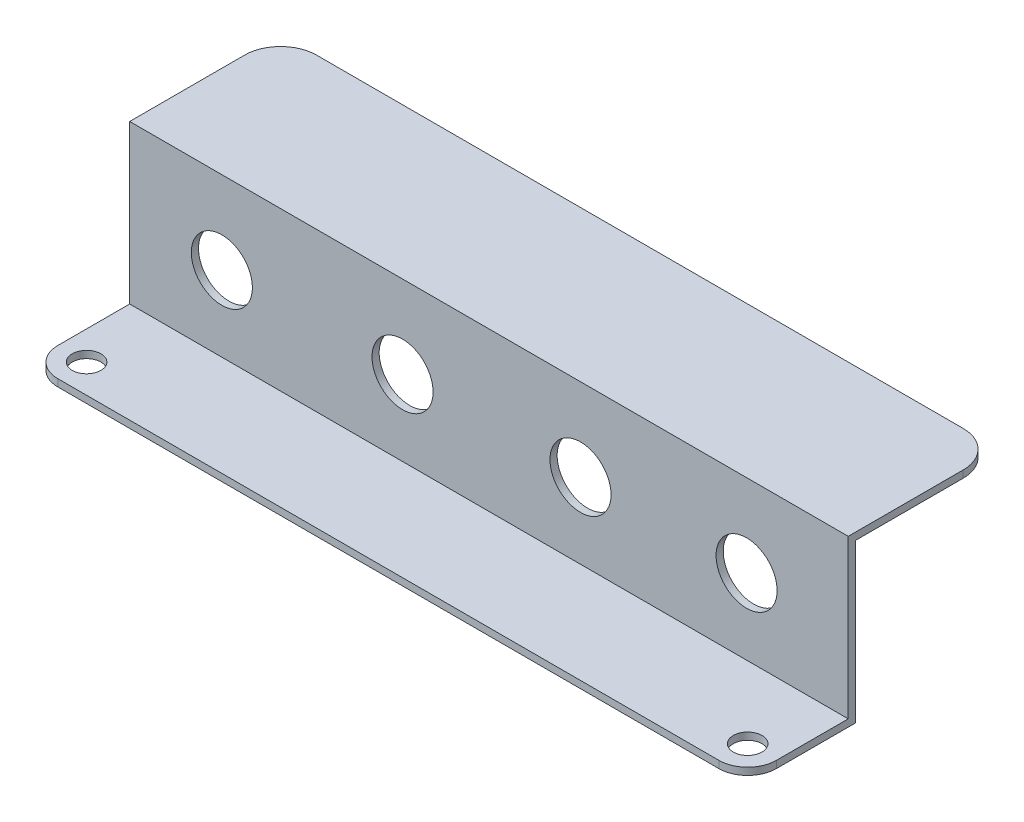
ISO-10303-21;
HEADER;
FILE_DESCRIPTION(('STEP AP214'),'2;1');
FILE_NAME('part.step','',(''),(''),'','','');
FILE_SCHEMA(('AUTOMOTIVE_DESIGN { 1 0 10303 214 1 1 1 1 }'));
ENDSEC;
DATA;
#1=APPLICATION_CONTEXT('core data for automotive mechanical design processes');
#2=APPLICATION_PROTOCOL_DEFINITION('international standard','automotive_design',2000,#1);
#3=PRODUCT_CONTEXT('',#1,'mechanical');
#4=PRODUCT('Part','Part','',(#3));
#5=PRODUCT_RELATED_PRODUCT_CATEGORY('part','',(#4));
#6=PRODUCT_DEFINITION_FORMATION('','',#4);
#7=PRODUCT_DEFINITION_CONTEXT('part definition',#1,'design');
#8=PRODUCT_DEFINITION('design','',#6,#7);
#9=PRODUCT_DEFINITION_SHAPE('','',#8);
#10=(LENGTH_UNIT() NAMED_UNIT(*) SI_UNIT(.MILLI.,.METRE.));
#11=(NAMED_UNIT(*) PLANE_ANGLE_UNIT() SI_UNIT($,.RADIAN.));
#12=(NAMED_UNIT(*) SI_UNIT($,.STERADIAN.) SOLID_ANGLE_UNIT());
#13=UNCERTAINTY_MEASURE_WITH_UNIT(LENGTH_MEASURE(1.E-05),#10,'distance_accuracy_value','');
#14=(GEOMETRIC_REPRESENTATION_CONTEXT(3) GLOBAL_UNCERTAINTY_ASSIGNED_CONTEXT((#13)) GLOBAL_UNIT_ASSIGNED_CONTEXT((#10,
#11,#12)) REPRESENTATION_CONTEXT('',''));
#15=CARTESIAN_POINT('',(0.,0.,0.));
#16=DIRECTION('',(0.,0.,1.));
#17=DIRECTION('',(1.,0.,0.));
#18=AXIS2_PLACEMENT_3D('',#15,#16,#17);
#19=CARTESIAN_POINT('',(0.,0.,11.));
#20=DIRECTION('',(0.,0.,1.));
#21=DIRECTION('',(1.,0.,0.));
#22=AXIS2_PLACEMENT_3D('',#19,#20,#21);
#23=PLANE('',#22);
#24=CARTESIAN_POINT('',(-37.1729743459487,-10.5,11.));
#25=DIRECTION('',(0.,0.,1.));
#26=DIRECTION('',(1.,0.,0.));
#27=AXIS2_PLACEMENT_3D('',#24,#25,#26);
#28=CIRCLE('',#27,4.25000000000001);
#29=CARTESIAN_POINT('',(-32.9229743459487,-10.5,11.));
#30=VERTEX_POINT('',#29);
#31=EDGE_CURVE('E313',#30,#30,#28,.T.);
#32=ORIENTED_EDGE('',*,*,#31,.F.);
#33=EDGE_LOOP('',(#32));
#34=FACE_BOUND('',#33,.T.);
#35=CARTESIAN_POINT('',(35.8521717043434,-10.5,11.));
#36=DIRECTION('',(0.,0.,1.));
#37=DIRECTION('',(1.,0.,0.));
#38=AXIS2_PLACEMENT_3D('',#35,#36,#37);
#39=CIRCLE('',#38,4.25000000000001);
#40=CARTESIAN_POINT('',(40.1021717043434,-10.5,11.));
#41=VERTEX_POINT('',#40);
#42=EDGE_CURVE('E312',#41,#41,#39,.T.);
#43=ORIENTED_EDGE('',*,*,#42,.F.);
#44=EDGE_LOOP('',(#43));
#45=FACE_BOUND('',#44,.T.);
#46=CARTESIAN_POINT('',(12.7381254762509,-10.5,11.));
#47=DIRECTION('',(0.,0.,1.));
#48=DIRECTION('',(1.,0.,0.));
#49=AXIS2_PLACEMENT_3D('',#46,#47,#48);
#50=CIRCLE('',#49,4.25);
#51=CARTESIAN_POINT('',(16.9881254762509,-10.5,11.));
#52=VERTEX_POINT('',#51);
#53=EDGE_CURVE('E319',#52,#52,#50,.T.);
#54=ORIENTED_EDGE('',*,*,#53,.F.);
#55=EDGE_LOOP('',(#54));
#56=FACE_BOUND('',#55,.T.);
#57=CARTESIAN_POINT('',(-12.026924053848,-10.5,11.));
#58=DIRECTION('',(0.,0.,1.));
#59=DIRECTION('',(1.,0.,0.));
#60=AXIS2_PLACEMENT_3D('',#57,#58,#59);
#61=CIRCLE('',#60,4.25);
#62=CARTESIAN_POINT('',(-7.77692405384802,-10.5,11.));
#63=VERTEX_POINT('',#62);
#64=EDGE_CURVE('E305',#63,#63,#61,.T.);
#65=ORIENTED_EDGE('',*,*,#64,.F.);
#66=EDGE_LOOP('',(#65));
#67=FACE_BOUND('',#66,.T.);
#68=DIRECTION('',(0.,-1.,0.));
#69=VECTOR('',#68,1.);
#70=CARTESIAN_POINT('',(-50.,1.,11.));
#71=LINE('',#70,#69);
#72=CARTESIAN_POINT('',(-50.,1.,11.));
#73=VERTEX_POINT('',#72);
#74=CARTESIAN_POINT('',(-50.,-21.,11.));
#75=VERTEX_POINT('',#74);
#76=EDGE_CURVE('E129',#73,#75,#71,.T.);
#77=ORIENTED_EDGE('',*,*,#76,.T.);
#78=DIRECTION('',(1.,0.,0.));
#79=VECTOR('',#78,1.);
#80=CARTESIAN_POINT('',(-50.,-21.,11.));
#81=LINE('',#80,#79);
#82=CARTESIAN_POINT('',(50.,-21.,11.));
#83=VERTEX_POINT('',#82);
#84=EDGE_CURVE('E135',#75,#83,#81,.T.);
#85=ORIENTED_EDGE('',*,*,#84,.T.);
#86=DIRECTION('',(0.,1.,0.));
#87=VECTOR('',#86,1.);
#88=CARTESIAN_POINT('',(50.,1.,11.));
#89=LINE('',#88,#87);
#90=CARTESIAN_POINT('',(50.,1.,11.));
#91=VERTEX_POINT('',#90);
#92=EDGE_CURVE('E148',#83,#91,#89,.T.);
#93=ORIENTED_EDGE('',*,*,#92,.T.);
#94=DIRECTION('',(-1.,0.,0.));
#95=VECTOR('',#94,1.);
#96=CARTESIAN_POINT('',(-50.,1.,11.));
#97=LINE('',#96,#95);
#98=EDGE_CURVE('E147',#91,#73,#97,.T.);
#99=ORIENTED_EDGE('',*,*,#98,.T.);
#100=EDGE_LOOP('',(#77,#85,#93,#99));
#101=FACE_BOUND('',#100,.T.);
#102=ADVANCED_FACE('F33',(#34,#45,#56,#67,#101),#23,.T.);
#103=CARTESIAN_POINT('',(50.,1.,10.));
#104=DIRECTION('',(-1.,0.,0.));
#105=DIRECTION('',(0.,0.,1.));
#106=AXIS2_PLACEMENT_3D('',#103,#104,#105);
#107=PLANE('',#106);
#108=DIRECTION('',(0.,0.,-1.));
#109=VECTOR('',#108,1.);
#110=CARTESIAN_POINT('',(50.,0.,10.));
#111=LINE('',#110,#109);
#112=CARTESIAN_POINT('',(50.,0.,10.));
#113=VERTEX_POINT('',#112);
#114=CARTESIAN_POINT('',(50.,0.,-5.));
#115=VERTEX_POINT('',#114);
#116=EDGE_CURVE('E169',#113,#115,#111,.T.);
#117=ORIENTED_EDGE('',*,*,#116,.T.);
#118=DIRECTION('',(0.,-1.,0.));
#119=VECTOR('',#118,1.);
#120=CARTESIAN_POINT('',(50.,1.,-5.));
#121=LINE('',#120,#119);
#122=CARTESIAN_POINT('',(50.,1.,-5.));
#123=VERTEX_POINT('',#122);
#124=EDGE_CURVE('E56',#115,#123,#121,.F.);
#125=ORIENTED_EDGE('',*,*,#124,.T.);
#126=DIRECTION('',(0.,0.,-1.));
#127=VECTOR('',#126,1.);
#128=CARTESIAN_POINT('',(50.,1.,10.));
#129=LINE('',#128,#127);
#130=EDGE_CURVE('E170',#91,#123,#129,.T.);
#131=ORIENTED_EDGE('',*,*,#130,.F.);
#132=ORIENTED_EDGE('',*,*,#92,.F.);
#133=DIRECTION('',(0.,0.,1.));
#134=VECTOR('',#133,1.);
#135=CARTESIAN_POINT('',(50.,-21.,11.));
#136=LINE('',#135,#134);
#137=CARTESIAN_POINT('',(50.,-21.,21.));
#138=VERTEX_POINT('',#137);
#139=EDGE_CURVE('E141',#83,#138,#136,.T.);
#140=ORIENTED_EDGE('',*,*,#139,.T.);
#141=DIRECTION('',(0.,-1.,0.));
#142=VECTOR('',#141,1.);
#143=CARTESIAN_POINT('',(50.,-22.,21.));
#144=LINE('',#143,#142);
#145=CARTESIAN_POINT('',(50.,-22.,21.));
#146=VERTEX_POINT('',#145);
#147=EDGE_CURVE('E199',#138,#146,#144,.T.);
#148=ORIENTED_EDGE('',*,*,#147,.T.);
#149=DIRECTION('',(0.,0.,-1.));
#150=VECTOR('',#149,1.);
#151=CARTESIAN_POINT('',(50.,-22.,11.));
#152=LINE('',#151,#150);
#153=CARTESIAN_POINT('',(50.,-22.,10.));
#154=VERTEX_POINT('',#153);
#155=EDGE_CURVE('E159',#146,#154,#152,.T.);
#156=ORIENTED_EDGE('',*,*,#155,.T.);
#157=DIRECTION('',(0.,1.,0.));
#158=VECTOR('',#157,1.);
#159=CARTESIAN_POINT('',(50.,1.,10.));
#160=LINE('',#159,#158);
#161=EDGE_CURVE('E149',#154,#113,#160,.T.);
#162=ORIENTED_EDGE('',*,*,#161,.T.);
#163=EDGE_LOOP('',(#117,#125,#131,#132,#140,#148,#156,#162));
#164=FACE_BOUND('',#163,.T.);
#165=ADVANCED_FACE('F225',(#164),#107,.F.);
#166=CARTESIAN_POINT('',(-50.,1.,-10.));
#167=DIRECTION('',(0.,0.,1.));
#168=DIRECTION('',(1.,0.,0.));
#169=AXIS2_PLACEMENT_3D('',#166,#167,#168);
#170=PLANE('',#169);
#171=DIRECTION('',(-1.,0.,0.));
#172=VECTOR('',#171,1.);
#173=CARTESIAN_POINT('',(-50.,1.,-10.));
#174=LINE('',#173,#172);
#175=CARTESIAN_POINT('',(45.,1.,-10.));
#176=VERTEX_POINT('',#175);
#177=CARTESIAN_POINT('',(-45.,1.,-10.));
#178=VERTEX_POINT('',#177);
#179=EDGE_CURVE('E172',#176,#178,#174,.T.);
#180=ORIENTED_EDGE('',*,*,#179,.F.);
#181=DIRECTION('',(0.,-1.,0.));
#182=VECTOR('',#181,1.);
#183=CARTESIAN_POINT('',(45.,1.,-10.));
#184=LINE('',#183,#182);
#185=CARTESIAN_POINT('',(45.,0.,-10.));
#186=VERTEX_POINT('',#185);
#187=EDGE_CURVE('E204',#176,#186,#184,.T.);
#188=ORIENTED_EDGE('',*,*,#187,.T.);
#189=DIRECTION('',(-1.,0.,0.));
#190=VECTOR('',#189,1.);
#191=CARTESIAN_POINT('',(-50.,0.,-10.));
#192=LINE('',#191,#190);
#193=CARTESIAN_POINT('',(-45.,0.,-10.));
#194=VERTEX_POINT('',#193);
#195=EDGE_CURVE('E179',#186,#194,#192,.T.);
#196=ORIENTED_EDGE('',*,*,#195,.T.);
#197=DIRECTION('',(0.,-1.,0.));
#198=VECTOR('',#197,1.);
#199=CARTESIAN_POINT('',(-45.,1.,-10.));
#200=LINE('',#199,#198);
#201=EDGE_CURVE('E202',#194,#178,#200,.F.);
#202=ORIENTED_EDGE('',*,*,#201,.T.);
#203=EDGE_LOOP('',(#180,#188,#196,#202));
#204=FACE_BOUND('',#203,.T.);
#205=ADVANCED_FACE('F218',(#204),#170,.F.);
#206=CARTESIAN_POINT('',(-50.,1.,10.));
#207=DIRECTION('',(1.,0.,0.));
#208=DIRECTION('',(0.,0.,-1.));
#209=AXIS2_PLACEMENT_3D('',#206,#207,#208);
#210=PLANE('',#209);
#211=DIRECTION('',(0.,0.,1.));
#212=VECTOR('',#211,1.);
#213=CARTESIAN_POINT('',(-50.,1.,10.));
#214=LINE('',#213,#212);
#215=CARTESIAN_POINT('',(-50.,1.,-5.));
#216=VERTEX_POINT('',#215);
#217=EDGE_CURVE('E175',#216,#73,#214,.T.);
#218=ORIENTED_EDGE('',*,*,#217,.F.);
#219=DIRECTION('',(0.,-1.,0.));
#220=VECTOR('',#219,1.);
#221=CARTESIAN_POINT('',(-50.,1.,-5.));
#222=LINE('',#221,#220);
#223=CARTESIAN_POINT('',(-50.,0.,-5.));
#224=VERTEX_POINT('',#223);
#225=EDGE_CURVE('E11',#216,#224,#222,.T.);
#226=ORIENTED_EDGE('',*,*,#225,.T.);
#227=DIRECTION('',(0.,0.,1.));
#228=VECTOR('',#227,1.);
#229=CARTESIAN_POINT('',(-50.,0.,10.));
#230=LINE('',#229,#228);
#231=CARTESIAN_POINT('',(-50.,0.,10.));
#232=VERTEX_POINT('',#231);
#233=EDGE_CURVE('E182',#224,#232,#230,.T.);
#234=ORIENTED_EDGE('',*,*,#233,.T.);
#235=DIRECTION('',(0.,-1.,0.));
#236=VECTOR('',#235,1.);
#237=CARTESIAN_POINT('',(-50.,1.,10.));
#238=LINE('',#237,#236);
#239=CARTESIAN_POINT('',(-50.,-22.,10.));
#240=VERTEX_POINT('',#239);
#241=EDGE_CURVE('E160',#232,#240,#238,.T.);
#242=ORIENTED_EDGE('',*,*,#241,.T.);
#243=DIRECTION('',(0.,0.,-1.));
#244=VECTOR('',#243,1.);
#245=CARTESIAN_POINT('',(-50.,-22.,11.));
#246=LINE('',#245,#244);
#247=CARTESIAN_POINT('',(-50.,-22.,21.));
#248=VERTEX_POINT('',#247);
#249=EDGE_CURVE('E167',#248,#240,#246,.T.);
#250=ORIENTED_EDGE('',*,*,#249,.F.);
#251=DIRECTION('',(0.,-1.,0.));
#252=VECTOR('',#251,1.);
#253=CARTESIAN_POINT('',(-50.,-21.,21.));
#254=LINE('',#253,#252);
#255=CARTESIAN_POINT('',(-50.,-21.,21.));
#256=VERTEX_POINT('',#255);
#257=EDGE_CURVE('E132',#248,#256,#254,.F.);
#258=ORIENTED_EDGE('',*,*,#257,.T.);
#259=DIRECTION('',(0.,0.,-1.));
#260=VECTOR('',#259,1.);
#261=CARTESIAN_POINT('',(-50.,-21.,11.));
#262=LINE('',#261,#260);
#263=EDGE_CURVE('E125',#256,#75,#262,.T.);
#264=ORIENTED_EDGE('',*,*,#263,.T.);
#265=ORIENTED_EDGE('',*,*,#76,.F.);
#266=EDGE_LOOP('',(#218,#226,#234,#242,#250,#258,#264,#265));
#267=FACE_BOUND('',#266,.T.);
#268=ADVANCED_FACE('F127',(#267),#210,.F.);
#269=CARTESIAN_POINT('',(0.,1.,0.));
#270=DIRECTION('',(0.,-1.,0.));
#271=DIRECTION('',(0.,0.,-1.));
#272=AXIS2_PLACEMENT_3D('',#269,#270,#271);
#273=PLANE('',#272);
#274=ORIENTED_EDGE('',*,*,#130,.T.);
#275=CARTESIAN_POINT('',(45.,1.,-5.));
#276=DIRECTION('',(0.,-1.,0.));
#277=DIRECTION('',(0.,0.,-1.));
#278=AXIS2_PLACEMENT_3D('',#275,#276,#277);
#279=CIRCLE('',#278,5.);
#280=EDGE_CURVE('E41',#123,#176,#279,.F.);
#281=ORIENTED_EDGE('',*,*,#280,.T.);
#282=ORIENTED_EDGE('',*,*,#179,.T.);
#283=CARTESIAN_POINT('',(-45.,1.,-5.));
#284=DIRECTION('',(0.,-1.,0.));
#285=DIRECTION('',(0.,0.,-1.));
#286=AXIS2_PLACEMENT_3D('',#283,#284,#285);
#287=CIRCLE('',#286,5.);
#288=EDGE_CURVE('E48',#178,#216,#287,.F.);
#289=ORIENTED_EDGE('',*,*,#288,.T.);
#290=ORIENTED_EDGE('',*,*,#217,.T.);
#291=ORIENTED_EDGE('',*,*,#98,.F.);
#292=EDGE_LOOP('',(#274,#281,#282,#289,#290,#291));
#293=FACE_BOUND('',#292,.T.);
#294=ADVANCED_FACE('F214',(#293),#273,.F.);
#295=CARTESIAN_POINT('',(0.,0.,0.));
#296=DIRECTION('',(0.,-1.,0.));
#297=DIRECTION('',(0.,0.,-1.));
#298=AXIS2_PLACEMENT_3D('',#295,#296,#297);
#299=PLANE('',#298);
#300=ORIENTED_EDGE('',*,*,#195,.F.);
#301=CARTESIAN_POINT('',(45.,0.,-5.));
#302=DIRECTION('',(0.,-1.,0.));
#303=DIRECTION('',(0.,0.,-1.));
#304=AXIS2_PLACEMENT_3D('',#301,#302,#303);
#305=CIRCLE('',#304,5.);
#306=EDGE_CURVE('E209',#186,#115,#305,.T.);
#307=ORIENTED_EDGE('',*,*,#306,.T.);
#308=ORIENTED_EDGE('',*,*,#116,.F.);
#309=DIRECTION('',(1.,0.,0.));
#310=VECTOR('',#309,1.);
#311=CARTESIAN_POINT('',(-50.,0.,10.));
#312=LINE('',#311,#310);
#313=EDGE_CURVE('E173',#232,#113,#312,.T.);
#314=ORIENTED_EDGE('',*,*,#313,.F.);
#315=ORIENTED_EDGE('',*,*,#233,.F.);
#316=CARTESIAN_POINT('',(-45.,0.,-5.));
#317=DIRECTION('',(0.,-1.,0.));
#318=DIRECTION('',(0.,0.,-1.));
#319=AXIS2_PLACEMENT_3D('',#316,#317,#318);
#320=CIRCLE('',#319,5.);
#321=EDGE_CURVE('E207',#224,#194,#320,.T.);
#322=ORIENTED_EDGE('',*,*,#321,.T.);
#323=EDGE_LOOP('',(#300,#307,#308,#314,#315,#322));
#324=FACE_BOUND('',#323,.T.);
#325=ADVANCED_FACE('F223',(#324),#299,.T.);
#326=CARTESIAN_POINT('',(0.,0.,10.));
#327=DIRECTION('',(0.,0.,1.));
#328=DIRECTION('',(1.,0.,0.));
#329=AXIS2_PLACEMENT_3D('',#326,#327,#328);
#330=PLANE('',#329);
#331=CARTESIAN_POINT('',(-37.1729743459487,-10.5,10.));
#332=DIRECTION('',(0.,0.,1.));
#333=DIRECTION('',(1.,0.,0.));
#334=AXIS2_PLACEMENT_3D('',#331,#332,#333);
#335=CIRCLE('',#334,4.25000000000001);
#336=CARTESIAN_POINT('',(-32.9229743459487,-10.5,10.));
#337=VERTEX_POINT('',#336);
#338=EDGE_CURVE('E309',#337,#337,#335,.F.);
#339=ORIENTED_EDGE('',*,*,#338,.F.);
#340=EDGE_LOOP('',(#339));
#341=FACE_BOUND('',#340,.T.);
#342=CARTESIAN_POINT('',(35.8521717043434,-10.5,10.));
#343=DIRECTION('',(0.,0.,1.));
#344=DIRECTION('',(1.,0.,0.));
#345=AXIS2_PLACEMENT_3D('',#342,#343,#344);
#346=CIRCLE('',#345,4.25000000000001);
#347=CARTESIAN_POINT('',(40.1021717043434,-10.5,10.));
#348=VERTEX_POINT('',#347);
#349=EDGE_CURVE('E316',#348,#348,#346,.F.);
#350=ORIENTED_EDGE('',*,*,#349,.F.);
#351=EDGE_LOOP('',(#350));
#352=FACE_BOUND('',#351,.T.);
#353=CARTESIAN_POINT('',(12.7381254762509,-10.5,10.));
#354=DIRECTION('',(0.,0.,1.));
#355=DIRECTION('',(1.,0.,0.));
#356=AXIS2_PLACEMENT_3D('',#353,#354,#355);
#357=CIRCLE('',#356,4.25);
#358=CARTESIAN_POINT('',(16.9881254762509,-10.5,10.));
#359=VERTEX_POINT('',#358);
#360=EDGE_CURVE('E308',#359,#359,#357,.F.);
#361=ORIENTED_EDGE('',*,*,#360,.F.);
#362=EDGE_LOOP('',(#361));
#363=FACE_BOUND('',#362,.T.);
#364=CARTESIAN_POINT('',(-12.026924053848,-10.5,10.));
#365=DIRECTION('',(0.,0.,1.));
#366=DIRECTION('',(1.,0.,0.));
#367=AXIS2_PLACEMENT_3D('',#364,#365,#366);
#368=CIRCLE('',#367,4.25);
#369=CARTESIAN_POINT('',(-7.77692405384802,-10.5,10.));
#370=VERTEX_POINT('',#369);
#371=EDGE_CURVE('E300',#370,#370,#368,.F.);
#372=ORIENTED_EDGE('',*,*,#371,.F.);
#373=EDGE_LOOP('',(#372));
#374=FACE_BOUND('',#373,.T.);
#375=ORIENTED_EDGE('',*,*,#241,.F.);
#376=ORIENTED_EDGE('',*,*,#313,.T.);
#377=ORIENTED_EDGE('',*,*,#161,.F.);
#378=DIRECTION('',(1.,0.,0.));
#379=VECTOR('',#378,1.);
#380=CARTESIAN_POINT('',(-50.,-22.,10.));
#381=LINE('',#380,#379);
#382=EDGE_CURVE('E153',#240,#154,#381,.T.);
#383=ORIENTED_EDGE('',*,*,#382,.F.);
#384=EDGE_LOOP('',(#375,#376,#377,#383));
#385=FACE_BOUND('',#384,.T.);
#386=ADVANCED_FACE('F231',(#341,#352,#363,#374,#385),#330,.F.);
#387=CARTESIAN_POINT('',(-50.,-22.,11.));
#388=DIRECTION('',(0.,1.,0.));
#389=DIRECTION('',(0.,0.,1.));
#390=AXIS2_PLACEMENT_3D('',#387,#388,#389);
#391=PLANE('',#390);
#392=DIRECTION('',(-1.,0.,0.));
#393=VECTOR('',#392,1.);
#394=CARTESIAN_POINT('',(-50.,-22.,25.));
#395=LINE('',#394,#393);
#396=CARTESIAN_POINT('',(46.,-22.,25.));
#397=VERTEX_POINT('',#396);
#398=CARTESIAN_POINT('',(-46.,-22.,25.));
#399=VERTEX_POINT('',#398);
#400=EDGE_CURVE('E136',#397,#399,#395,.T.);
#401=ORIENTED_EDGE('',*,*,#400,.T.);
#402=CARTESIAN_POINT('',(-46.,-22.,21.));
#403=DIRECTION('',(0.,1.,0.));
#404=DIRECTION('',(0.,0.,1.));
#405=AXIS2_PLACEMENT_3D('',#402,#403,#404);
#406=CIRCLE('',#405,4.);
#407=EDGE_CURVE('E192',#399,#248,#406,.F.);
#408=ORIENTED_EDGE('',*,*,#407,.T.);
#409=ORIENTED_EDGE('',*,*,#249,.T.);
#410=ORIENTED_EDGE('',*,*,#382,.T.);
#411=ORIENTED_EDGE('',*,*,#155,.F.);
#412=CARTESIAN_POINT('',(46.,-22.,21.));
#413=DIRECTION('',(0.,1.,0.));
#414=DIRECTION('',(0.,0.,1.));
#415=AXIS2_PLACEMENT_3D('',#412,#413,#414);
#416=CIRCLE('',#415,4.);
#417=EDGE_CURVE('E190',#146,#397,#416,.F.);
#418=ORIENTED_EDGE('',*,*,#417,.T.);
#419=EDGE_LOOP('',(#401,#408,#409,#410,#411,#418));
#420=FACE_BOUND('',#419,.T.);
#421=CARTESIAN_POINT('',(-46.,-22.,21.));
#422=DIRECTION('',(0.,-1.,0.));
#423=DIRECTION('',(0.,0.,-1.));
#424=AXIS2_PLACEMENT_3D('',#421,#422,#423);
#425=CIRCLE('',#424,2.);
#426=CARTESIAN_POINT('',(-46.,-22.,19.));
#427=VERTEX_POINT('',#426);
#428=EDGE_CURVE('E297',#427,#427,#425,.T.);
#429=ORIENTED_EDGE('',*,*,#428,.F.);
#430=EDGE_LOOP('',(#429));
#431=FACE_BOUND('',#430,.T.);
#432=CARTESIAN_POINT('',(46.,-22.,21.));
#433=DIRECTION('',(0.,-1.,0.));
#434=DIRECTION('',(0.,0.,-1.));
#435=AXIS2_PLACEMENT_3D('',#432,#433,#434);
#436=CIRCLE('',#435,2.);
#437=CARTESIAN_POINT('',(46.,-22.,19.));
#438=VERTEX_POINT('',#437);
#439=EDGE_CURVE('E290',#438,#438,#436,.T.);
#440=ORIENTED_EDGE('',*,*,#439,.F.);
#441=EDGE_LOOP('',(#440));
#442=FACE_BOUND('',#441,.T.);
#443=ADVANCED_FACE('F255',(#420,#431,#442),#391,.F.);
#444=CARTESIAN_POINT('',(-50.,-21.,25.));
#445=DIRECTION('',(0.,0.,1.));
#446=DIRECTION('',(1.,0.,0.));
#447=AXIS2_PLACEMENT_3D('',#444,#445,#446);
#448=PLANE('',#447);
#449=DIRECTION('',(-1.,0.,0.));
#450=VECTOR('',#449,1.);
#451=CARTESIAN_POINT('',(-50.,-21.,25.));
#452=LINE('',#451,#450);
#453=CARTESIAN_POINT('',(46.,-21.,25.));
#454=VERTEX_POINT('',#453);
#455=CARTESIAN_POINT('',(-46.,-21.,25.));
#456=VERTEX_POINT('',#455);
#457=EDGE_CURVE('E163',#454,#456,#452,.T.);
#458=ORIENTED_EDGE('',*,*,#457,.T.);
#459=DIRECTION('',(0.,-1.,0.));
#460=VECTOR('',#459,1.);
#461=CARTESIAN_POINT('',(-46.,-22.,25.));
#462=LINE('',#461,#460);
#463=EDGE_CURVE('E187',#456,#399,#462,.T.);
#464=ORIENTED_EDGE('',*,*,#463,.T.);
#465=ORIENTED_EDGE('',*,*,#400,.F.);
#466=DIRECTION('',(0.,-1.,0.));
#467=VECTOR('',#466,1.);
#468=CARTESIAN_POINT('',(46.,-21.,25.));
#469=LINE('',#468,#467);
#470=EDGE_CURVE('E177',#397,#454,#469,.F.);
#471=ORIENTED_EDGE('',*,*,#470,.T.);
#472=EDGE_LOOP('',(#458,#464,#465,#471));
#473=FACE_BOUND('',#472,.T.);
#474=ADVANCED_FACE('F251',(#473),#448,.T.);
#475=CARTESIAN_POINT('',(0.,-21.,0.));
#476=DIRECTION('',(0.,1.,0.));
#477=DIRECTION('',(0.,0.,1.));
#478=AXIS2_PLACEMENT_3D('',#475,#476,#477);
#479=PLANE('',#478);
#480=CARTESIAN_POINT('',(-46.,-21.,21.));
#481=DIRECTION('',(0.,-1.,0.));
#482=DIRECTION('',(0.,0.,-1.));
#483=AXIS2_PLACEMENT_3D('',#480,#481,#482);
#484=CIRCLE('',#483,2.);
#485=CARTESIAN_POINT('',(-46.,-21.,19.));
#486=VERTEX_POINT('',#485);
#487=EDGE_CURVE('E294',#486,#486,#484,.T.);
#488=ORIENTED_EDGE('',*,*,#487,.T.);
#489=EDGE_LOOP('',(#488));
#490=FACE_BOUND('',#489,.T.);
#491=CARTESIAN_POINT('',(46.,-21.,21.));
#492=DIRECTION('',(0.,-1.,0.));
#493=DIRECTION('',(0.,0.,-1.));
#494=AXIS2_PLACEMENT_3D('',#491,#492,#493);
#495=CIRCLE('',#494,2.);
#496=CARTESIAN_POINT('',(46.,-21.,19.));
#497=VERTEX_POINT('',#496);
#498=EDGE_CURVE('E293',#497,#497,#495,.T.);
#499=ORIENTED_EDGE('',*,*,#498,.T.);
#500=EDGE_LOOP('',(#499));
#501=FACE_BOUND('',#500,.T.);
#502=ORIENTED_EDGE('',*,*,#263,.F.);
#503=CARTESIAN_POINT('',(-46.,-21.,21.));
#504=DIRECTION('',(0.,1.,0.));
#505=DIRECTION('',(0.,0.,1.));
#506=AXIS2_PLACEMENT_3D('',#503,#504,#505);
#507=CIRCLE('',#506,4.);
#508=EDGE_CURVE('E197',#256,#456,#507,.T.);
#509=ORIENTED_EDGE('',*,*,#508,.T.);
#510=ORIENTED_EDGE('',*,*,#457,.F.);
#511=CARTESIAN_POINT('',(46.,-21.,21.));
#512=DIRECTION('',(0.,1.,0.));
#513=DIRECTION('',(0.,0.,1.));
#514=AXIS2_PLACEMENT_3D('',#511,#512,#513);
#515=CIRCLE('',#514,4.);
#516=EDGE_CURVE('E195',#454,#138,#515,.T.);
#517=ORIENTED_EDGE('',*,*,#516,.T.);
#518=ORIENTED_EDGE('',*,*,#139,.F.);
#519=ORIENTED_EDGE('',*,*,#84,.F.);
#520=EDGE_LOOP('',(#502,#509,#510,#517,#518,#519));
#521=FACE_BOUND('',#520,.T.);
#522=ADVANCED_FACE('F139',(#490,#501,#521),#479,.T.);
#523=CARTESIAN_POINT('',(46.,-21.,21.));
#524=DIRECTION('',(0.,-1.,0.));
#525=DIRECTION('',(0.,0.,-1.));
#526=AXIS2_PLACEMENT_3D('',#523,#524,#525);
#527=CYLINDRICAL_SURFACE('',#526,2.);
#528=ORIENTED_EDGE('',*,*,#498,.F.);
#529=EDGE_LOOP('',(#528));
#530=FACE_BOUND('',#529,.T.);
#531=ORIENTED_EDGE('',*,*,#439,.T.);
#532=EDGE_LOOP('',(#531));
#533=FACE_BOUND('',#532,.T.);
#534=ADVANCED_FACE('F350',(#530,#533),#527,.F.);
#535=CARTESIAN_POINT('',(-46.,-21.,21.));
#536=DIRECTION('',(0.,-1.,0.));
#537=DIRECTION('',(0.,0.,-1.));
#538=AXIS2_PLACEMENT_3D('',#535,#536,#537);
#539=CYLINDRICAL_SURFACE('',#538,2.);
#540=ORIENTED_EDGE('',*,*,#487,.F.);
#541=EDGE_LOOP('',(#540));
#542=FACE_BOUND('',#541,.T.);
#543=ORIENTED_EDGE('',*,*,#428,.T.);
#544=EDGE_LOOP('',(#543));
#545=FACE_BOUND('',#544,.T.);
#546=ADVANCED_FACE('F272',(#542,#545),#539,.F.);
#547=CARTESIAN_POINT('',(-46.,-21.,21.));
#548=DIRECTION('',(0.,1.,0.));
#549=DIRECTION('',(0.,0.,1.));
#550=AXIS2_PLACEMENT_3D('',#547,#548,#549);
#551=CYLINDRICAL_SURFACE('',#550,4.);
#552=ORIENTED_EDGE('',*,*,#508,.F.);
#553=ORIENTED_EDGE('',*,*,#257,.F.);
#554=ORIENTED_EDGE('',*,*,#407,.F.);
#555=ORIENTED_EDGE('',*,*,#463,.F.);
#556=EDGE_LOOP('',(#552,#553,#554,#555));
#557=FACE_BOUND('',#556,.T.);
#558=ADVANCED_FACE('F268',(#557),#551,.T.);
#559=CARTESIAN_POINT('',(46.,1.,21.));
#560=DIRECTION('',(0.,1.,0.));
#561=DIRECTION('',(0.,0.,1.));
#562=AXIS2_PLACEMENT_3D('',#559,#560,#561);
#563=CYLINDRICAL_SURFACE('',#562,4.);
#564=ORIENTED_EDGE('',*,*,#516,.F.);
#565=ORIENTED_EDGE('',*,*,#470,.F.);
#566=ORIENTED_EDGE('',*,*,#417,.F.);
#567=ORIENTED_EDGE('',*,*,#147,.F.);
#568=EDGE_LOOP('',(#564,#565,#566,#567));
#569=FACE_BOUND('',#568,.T.);
#570=ADVANCED_FACE('F271',(#569),#563,.T.);
#571=CARTESIAN_POINT('',(-12.026924053848,-10.5,-10.001));
#572=DIRECTION('',(0.,0.,1.));
#573=DIRECTION('',(1.,0.,0.));
#574=AXIS2_PLACEMENT_3D('',#571,#572,#573);
#575=CYLINDRICAL_SURFACE('',#574,4.25);
#576=ORIENTED_EDGE('',*,*,#64,.T.);
#577=EDGE_LOOP('',(#576));
#578=FACE_BOUND('',#577,.T.);
#579=ORIENTED_EDGE('',*,*,#371,.T.);
#580=EDGE_LOOP('',(#579));
#581=FACE_BOUND('',#580,.T.);
#582=ADVANCED_FACE('F275',(#578,#581),#575,.F.);
#583=CARTESIAN_POINT('',(12.7381254762509,-10.5,-10.001));
#584=DIRECTION('',(0.,0.,1.));
#585=DIRECTION('',(1.,0.,0.));
#586=AXIS2_PLACEMENT_3D('',#583,#584,#585);
#587=CYLINDRICAL_SURFACE('',#586,4.25);
#588=ORIENTED_EDGE('',*,*,#53,.T.);
#589=EDGE_LOOP('',(#588));
#590=FACE_BOUND('',#589,.T.);
#591=ORIENTED_EDGE('',*,*,#360,.T.);
#592=EDGE_LOOP('',(#591));
#593=FACE_BOUND('',#592,.T.);
#594=ADVANCED_FACE('F280',(#590,#593),#587,.F.);
#595=CARTESIAN_POINT('',(35.8521717043434,-10.5,-10.001));
#596=DIRECTION('',(0.,0.,1.));
#597=DIRECTION('',(1.,0.,0.));
#598=AXIS2_PLACEMENT_3D('',#595,#596,#597);
#599=CYLINDRICAL_SURFACE('',#598,4.25000000000001);
#600=ORIENTED_EDGE('',*,*,#42,.T.);
#601=EDGE_LOOP('',(#600));
#602=FACE_BOUND('',#601,.T.);
#603=ORIENTED_EDGE('',*,*,#349,.T.);
#604=EDGE_LOOP('',(#603));
#605=FACE_BOUND('',#604,.T.);
#606=ADVANCED_FACE('F335',(#602,#605),#599,.F.);
#607=CARTESIAN_POINT('',(-37.1729743459487,-10.5,-10.001));
#608=DIRECTION('',(0.,0.,1.));
#609=DIRECTION('',(1.,0.,0.));
#610=AXIS2_PLACEMENT_3D('',#607,#608,#609);
#611=CYLINDRICAL_SURFACE('',#610,4.25000000000001);
#612=ORIENTED_EDGE('',*,*,#31,.T.);
#613=EDGE_LOOP('',(#612));
#614=FACE_BOUND('',#613,.T.);
#615=ORIENTED_EDGE('',*,*,#338,.T.);
#616=EDGE_LOOP('',(#615));
#617=FACE_BOUND('',#616,.T.);
#618=ADVANCED_FACE('F239',(#614,#617),#611,.F.);
#619=CARTESIAN_POINT('',(45.,1.,-5.));
#620=DIRECTION('',(0.,-1.,0.));
#621=DIRECTION('',(0.,0.,-1.));
#622=AXIS2_PLACEMENT_3D('',#619,#620,#621);
#623=CYLINDRICAL_SURFACE('',#622,5.);
#624=ORIENTED_EDGE('',*,*,#280,.F.);
#625=ORIENTED_EDGE('',*,*,#124,.F.);
#626=ORIENTED_EDGE('',*,*,#306,.F.);
#627=ORIENTED_EDGE('',*,*,#187,.F.);
#628=EDGE_LOOP('',(#624,#625,#626,#627));
#629=FACE_BOUND('',#628,.T.);
#630=ADVANCED_FACE('F221',(#629),#623,.T.);
#631=CARTESIAN_POINT('',(-45.,1.,-5.));
#632=DIRECTION('',(0.,-1.,0.));
#633=DIRECTION('',(0.,0.,-1.));
#634=AXIS2_PLACEMENT_3D('',#631,#632,#633);
#635=CYLINDRICAL_SURFACE('',#634,5.);
#636=ORIENTED_EDGE('',*,*,#288,.F.);
#637=ORIENTED_EDGE('',*,*,#201,.F.);
#638=ORIENTED_EDGE('',*,*,#321,.F.);
#639=ORIENTED_EDGE('',*,*,#225,.F.);
#640=EDGE_LOOP('',(#636,#637,#638,#639));
#641=FACE_BOUND('',#640,.T.);
#642=ADVANCED_FACE('F35',(#641),#635,.T.);
#643=CLOSED_SHELL('',(#102,#165,#205,#268,#294,#325,#386,#443,#474,#522,#534,#546,#558,#570,
#582,#594,#606,#618,#630,#642));
#644=MANIFOLD_SOLID_BREP('B2',#643);
#645=ADVANCED_BREP_SHAPE_REPRESENTATION('',(#18,#644),#14);
#646=SHAPE_DEFINITION_REPRESENTATION(#9,#645);
ENDSEC;
END-ISO-10303-21;
